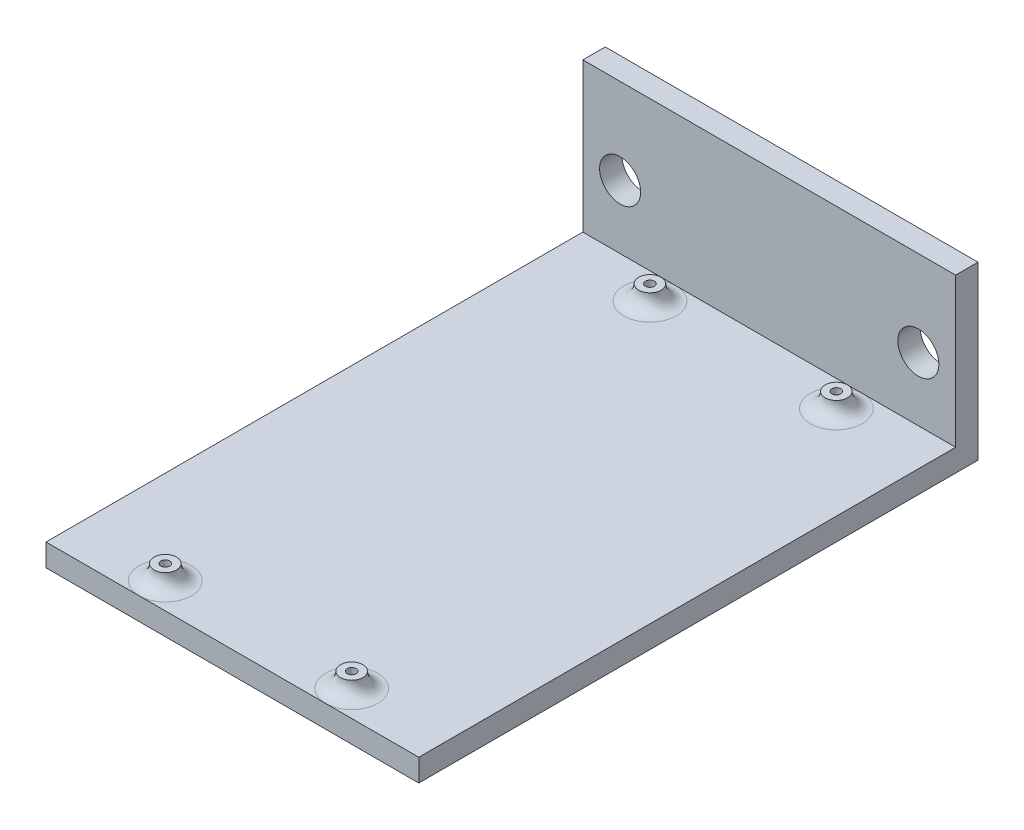
ISO-10303-21;
HEADER;
FILE_DESCRIPTION(('STEP AP214'),'2;1');
FILE_NAME('part.step','',(''),(''),'','','');
FILE_SCHEMA(('AUTOMOTIVE_DESIGN { 1 0 10303 214 1 1 1 1 }'));
ENDSEC;
DATA;
#1=APPLICATION_CONTEXT('core data for automotive mechanical design processes');
#2=APPLICATION_PROTOCOL_DEFINITION('international standard','automotive_design',2000,#1);
#3=PRODUCT_CONTEXT('',#1,'mechanical');
#4=PRODUCT('Part','Part','',(#3));
#5=PRODUCT_RELATED_PRODUCT_CATEGORY('part','',(#4));
#6=PRODUCT_DEFINITION_FORMATION('','',#4);
#7=PRODUCT_DEFINITION_CONTEXT('part definition',#1,'design');
#8=PRODUCT_DEFINITION('design','',#6,#7);
#9=PRODUCT_DEFINITION_SHAPE('','',#8);
#10=(LENGTH_UNIT() NAMED_UNIT(*) SI_UNIT(.MILLI.,.METRE.));
#11=(NAMED_UNIT(*) PLANE_ANGLE_UNIT() SI_UNIT($,.RADIAN.));
#12=(NAMED_UNIT(*) SI_UNIT($,.STERADIAN.) SOLID_ANGLE_UNIT());
#13=UNCERTAINTY_MEASURE_WITH_UNIT(LENGTH_MEASURE(1.E-05),#10,'distance_accuracy_value','');
#14=(GEOMETRIC_REPRESENTATION_CONTEXT(3) GLOBAL_UNCERTAINTY_ASSIGNED_CONTEXT((#13)) GLOBAL_UNIT_ASSIGNED_CONTEXT((#10,
#11,#12)) REPRESENTATION_CONTEXT('',''));
#15=CARTESIAN_POINT('',(0.,0.,0.));
#16=DIRECTION('',(0.,0.,1.));
#17=DIRECTION('',(1.,0.,0.));
#18=AXIS2_PLACEMENT_3D('',#15,#16,#17);
#19=CARTESIAN_POINT('',(25.,3.,-37.5));
#20=DIRECTION('',(-1.,0.,0.));
#21=DIRECTION('',(0.,0.,1.));
#22=AXIS2_PLACEMENT_3D('',#19,#20,#21);
#23=PLANE('',#22);
#24=DIRECTION('',(0.,0.,-1.));
#25=VECTOR('',#24,1.);
#26=CARTESIAN_POINT('',(25.,0.,-37.5));
#27=LINE('',#26,#25);
#28=CARTESIAN_POINT('',(25.,0.,37.5));
#29=VERTEX_POINT('',#28);
#30=CARTESIAN_POINT('',(25.,0.,-37.5));
#31=VERTEX_POINT('',#30);
#32=EDGE_CURVE('E129',#29,#31,#27,.T.);
#33=ORIENTED_EDGE('',*,*,#32,.T.);
#34=DIRECTION('',(0.,-1.,0.));
#35=VECTOR('',#34,1.);
#36=CARTESIAN_POINT('',(25.,3.,-37.5));
#37=LINE('',#36,#35);
#38=CARTESIAN_POINT('',(25.,23.,-37.5));
#39=VERTEX_POINT('',#38);
#40=EDGE_CURVE('E170',#39,#31,#37,.T.);
#41=ORIENTED_EDGE('',*,*,#40,.F.);
#42=DIRECTION('',(0.,0.,-1.));
#43=VECTOR('',#42,1.);
#44=CARTESIAN_POINT('',(25.,23.,-37.5));
#45=LINE('',#44,#43);
#46=CARTESIAN_POINT('',(25.,23.,-34.5));
#47=VERTEX_POINT('',#46);
#48=EDGE_CURVE('E111',#47,#39,#45,.T.);
#49=ORIENTED_EDGE('',*,*,#48,.F.);
#50=DIRECTION('',(0.,-1.,0.));
#51=VECTOR('',#50,1.);
#52=CARTESIAN_POINT('',(25.,23.,-34.5));
#53=LINE('',#52,#51);
#54=CARTESIAN_POINT('',(25.,3.,-34.5));
#55=VERTEX_POINT('',#54);
#56=EDGE_CURVE('E106',#47,#55,#53,.T.);
#57=ORIENTED_EDGE('',*,*,#56,.T.);
#58=DIRECTION('',(0.,0.,-1.));
#59=VECTOR('',#58,1.);
#60=CARTESIAN_POINT('',(25.,3.,-37.5));
#61=LINE('',#60,#59);
#62=CARTESIAN_POINT('',(25.,3.,37.5));
#63=VERTEX_POINT('',#62);
#64=EDGE_CURVE('E139',#63,#55,#61,.T.);
#65=ORIENTED_EDGE('',*,*,#64,.F.);
#66=DIRECTION('',(0.,-1.,0.));
#67=VECTOR('',#66,1.);
#68=CARTESIAN_POINT('',(25.,3.,37.5));
#69=LINE('',#68,#67);
#70=EDGE_CURVE('E150',#63,#29,#69,.T.);
#71=ORIENTED_EDGE('',*,*,#70,.T.);
#72=EDGE_LOOP('',(#33,#41,#49,#57,#65,#71));
#73=FACE_BOUND('',#72,.T.);
#74=ADVANCED_FACE('F38',(#73),#23,.F.);
#75=CARTESIAN_POINT('',(-25.,3.,-37.5));
#76=DIRECTION('',(0.,0.,1.));
#77=DIRECTION('',(1.,0.,0.));
#78=AXIS2_PLACEMENT_3D('',#75,#76,#77);
#79=PLANE('',#78);
#80=CARTESIAN_POINT('',(20.,11.5,-37.5));
#81=DIRECTION('',(0.,0.,-1.));
#82=DIRECTION('',(-1.,0.,0.));
#83=AXIS2_PLACEMENT_3D('',#80,#81,#82);
#84=CIRCLE('',#83,2.74999999999999);
#85=CARTESIAN_POINT('',(17.25,11.5,-37.5));
#86=VERTEX_POINT('',#85);
#87=EDGE_CURVE('E230',#86,#86,#84,.T.);
#88=ORIENTED_EDGE('',*,*,#87,.F.);
#89=EDGE_LOOP('',(#88));
#90=FACE_BOUND('',#89,.T.);
#91=CARTESIAN_POINT('',(-20.,11.5,-37.5));
#92=DIRECTION('',(0.,0.,-1.));
#93=DIRECTION('',(-1.,0.,0.));
#94=AXIS2_PLACEMENT_3D('',#91,#92,#93);
#95=CIRCLE('',#94,2.74999999999999);
#96=CARTESIAN_POINT('',(-22.75,11.5,-37.5));
#97=VERTEX_POINT('',#96);
#98=EDGE_CURVE('E180',#97,#97,#95,.T.);
#99=ORIENTED_EDGE('',*,*,#98,.F.);
#100=EDGE_LOOP('',(#99));
#101=FACE_BOUND('',#100,.T.);
#102=DIRECTION('',(-1.,0.,0.));
#103=VECTOR('',#102,1.);
#104=CARTESIAN_POINT('',(-25.,0.,-37.5));
#105=LINE('',#104,#103);
#106=CARTESIAN_POINT('',(-25.,0.,-37.5));
#107=VERTEX_POINT('',#106);
#108=EDGE_CURVE('E134',#31,#107,#105,.T.);
#109=ORIENTED_EDGE('',*,*,#108,.T.);
#110=DIRECTION('',(0.,-1.,0.));
#111=VECTOR('',#110,1.);
#112=CARTESIAN_POINT('',(-25.,3.,-37.5));
#113=LINE('',#112,#111);
#114=CARTESIAN_POINT('',(-25.,23.,-37.5));
#115=VERTEX_POINT('',#114);
#116=EDGE_CURVE('E167',#115,#107,#113,.T.);
#117=ORIENTED_EDGE('',*,*,#116,.F.);
#118=DIRECTION('',(-1.,0.,0.));
#119=VECTOR('',#118,1.);
#120=CARTESIAN_POINT('',(-25.,23.,-37.5));
#121=LINE('',#120,#119);
#122=EDGE_CURVE('E118',#39,#115,#121,.T.);
#123=ORIENTED_EDGE('',*,*,#122,.F.);
#124=ORIENTED_EDGE('',*,*,#40,.T.);
#125=EDGE_LOOP('',(#109,#117,#123,#124));
#126=FACE_BOUND('',#125,.T.);
#127=ADVANCED_FACE('F251',(#90,#101,#126),#79,.F.);
#128=CARTESIAN_POINT('',(-25.,3.,-37.5));
#129=DIRECTION('',(1.,0.,0.));
#130=DIRECTION('',(0.,0.,-1.));
#131=AXIS2_PLACEMENT_3D('',#128,#129,#130);
#132=PLANE('',#131);
#133=DIRECTION('',(0.,0.,1.));
#134=VECTOR('',#133,1.);
#135=CARTESIAN_POINT('',(-25.,0.,-37.5));
#136=LINE('',#135,#134);
#137=CARTESIAN_POINT('',(-25.,0.,37.5));
#138=VERTEX_POINT('',#137);
#139=EDGE_CURVE('E155',#107,#138,#136,.T.);
#140=ORIENTED_EDGE('',*,*,#139,.T.);
#141=DIRECTION('',(0.,-1.,0.));
#142=VECTOR('',#141,1.);
#143=CARTESIAN_POINT('',(-25.,3.,37.5));
#144=LINE('',#143,#142);
#145=CARTESIAN_POINT('',(-25.,3.,37.5));
#146=VERTEX_POINT('',#145);
#147=EDGE_CURVE('E163',#146,#138,#144,.T.);
#148=ORIENTED_EDGE('',*,*,#147,.F.);
#149=DIRECTION('',(0.,0.,1.));
#150=VECTOR('',#149,1.);
#151=CARTESIAN_POINT('',(-25.,3.,-37.5));
#152=LINE('',#151,#150);
#153=CARTESIAN_POINT('',(-25.,3.,-34.5));
#154=VERTEX_POINT('',#153);
#155=EDGE_CURVE('E127',#154,#146,#152,.T.);
#156=ORIENTED_EDGE('',*,*,#155,.F.);
#157=DIRECTION('',(0.,-1.,0.));
#158=VECTOR('',#157,1.);
#159=CARTESIAN_POINT('',(-25.,23.,-34.5));
#160=LINE('',#159,#158);
#161=CARTESIAN_POINT('',(-25.,23.,-34.5));
#162=VERTEX_POINT('',#161);
#163=EDGE_CURVE('E104',#162,#154,#160,.T.);
#164=ORIENTED_EDGE('',*,*,#163,.F.);
#165=DIRECTION('',(0.,0.,1.));
#166=VECTOR('',#165,1.);
#167=CARTESIAN_POINT('',(-25.,23.,-37.5));
#168=LINE('',#167,#166);
#169=EDGE_CURVE('E112',#115,#162,#168,.T.);
#170=ORIENTED_EDGE('',*,*,#169,.F.);
#171=ORIENTED_EDGE('',*,*,#116,.T.);
#172=EDGE_LOOP('',(#140,#148,#156,#164,#170,#171));
#173=FACE_BOUND('',#172,.T.);
#174=ADVANCED_FACE('F125',(#173),#132,.F.);
#175=CARTESIAN_POINT('',(-25.,3.,37.5));
#176=DIRECTION('',(0.,0.,-1.));
#177=DIRECTION('',(-1.,0.,0.));
#178=AXIS2_PLACEMENT_3D('',#175,#176,#177);
#179=PLANE('',#178);
#180=DIRECTION('',(1.,0.,0.));
#181=VECTOR('',#180,1.);
#182=CARTESIAN_POINT('',(-25.,0.,37.5));
#183=LINE('',#182,#181);
#184=EDGE_CURVE('E143',#138,#29,#183,.T.);
#185=ORIENTED_EDGE('',*,*,#184,.T.);
#186=ORIENTED_EDGE('',*,*,#70,.F.);
#187=DIRECTION('',(1.,0.,0.));
#188=VECTOR('',#187,1.);
#189=CARTESIAN_POINT('',(-25.,3.,37.5));
#190=LINE('',#189,#188);
#191=CARTESIAN_POINT('',(12.5,3.,37.5));
#192=VERTEX_POINT('',#191);
#193=EDGE_CURVE('E146',#192,#63,#190,.T.);
#194=ORIENTED_EDGE('',*,*,#193,.F.);
#195=CARTESIAN_POINT('',(-12.5,3.,37.5));
#196=VERTEX_POINT('',#195);
#197=EDGE_CURVE('E151',#196,#192,#190,.T.);
#198=ORIENTED_EDGE('',*,*,#197,.F.);
#199=EDGE_CURVE('E147',#146,#196,#190,.T.);
#200=ORIENTED_EDGE('',*,*,#199,.F.);
#201=ORIENTED_EDGE('',*,*,#147,.T.);
#202=EDGE_LOOP('',(#185,#186,#194,#198,#200,#201));
#203=FACE_BOUND('',#202,.T.);
#204=ADVANCED_FACE('F195',(#203),#179,.F.);
#205=CARTESIAN_POINT('',(0.,3.,0.));
#206=DIRECTION('',(0.,1.,0.));
#207=DIRECTION('',(0.,0.,1.));
#208=AXIS2_PLACEMENT_3D('',#205,#206,#207);
#209=PLANE('',#208);
#210=ORIENTED_EDGE('',*,*,#197,.T.);
#211=CARTESIAN_POINT('',(12.5,3.,34.));
#212=DIRECTION('',(0.,1.,0.));
#213=DIRECTION('',(0.,0.,1.));
#214=AXIS2_PLACEMENT_3D('',#211,#212,#213);
#215=CIRCLE('',#214,3.5);
#216=EDGE_CURVE('E11',#192,#192,#215,.F.);
#217=ORIENTED_EDGE('',*,*,#216,.T.);
#218=ORIENTED_EDGE('',*,*,#193,.T.);
#219=ORIENTED_EDGE('',*,*,#64,.T.);
#220=DIRECTION('',(1.,0.,0.));
#221=VECTOR('',#220,1.);
#222=CARTESIAN_POINT('',(-25.,3.,-34.5));
#223=LINE('',#222,#221);
#224=CARTESIAN_POINT('',(12.5,3.,-34.5));
#225=VERTEX_POINT('',#224);
#226=EDGE_CURVE('E179',#225,#55,#223,.T.);
#227=ORIENTED_EDGE('',*,*,#226,.F.);
#228=CARTESIAN_POINT('',(12.5,3.,-31.));
#229=DIRECTION('',(0.,1.,0.));
#230=DIRECTION('',(0.,0.,1.));
#231=AXIS2_PLACEMENT_3D('',#228,#229,#230);
#232=CIRCLE('',#231,3.5);
#233=EDGE_CURVE('E184',#225,#225,#232,.F.);
#234=ORIENTED_EDGE('',*,*,#233,.T.);
#235=CARTESIAN_POINT('',(-12.5,3.,-34.5));
#236=VERTEX_POINT('',#235);
#237=EDGE_CURVE('E209',#236,#225,#223,.T.);
#238=ORIENTED_EDGE('',*,*,#237,.F.);
#239=CARTESIAN_POINT('',(-12.5,3.,-31.));
#240=DIRECTION('',(0.,1.,0.));
#241=DIRECTION('',(0.,0.,1.));
#242=AXIS2_PLACEMENT_3D('',#239,#240,#241);
#243=CIRCLE('',#242,3.5);
#244=EDGE_CURVE('E174',#236,#236,#243,.F.);
#245=ORIENTED_EDGE('',*,*,#244,.T.);
#246=EDGE_CURVE('E122',#154,#236,#223,.T.);
#247=ORIENTED_EDGE('',*,*,#246,.F.);
#248=ORIENTED_EDGE('',*,*,#155,.T.);
#249=ORIENTED_EDGE('',*,*,#199,.T.);
#250=CARTESIAN_POINT('',(-12.5,3.,34.));
#251=DIRECTION('',(0.,1.,0.));
#252=DIRECTION('',(0.,0.,1.));
#253=AXIS2_PLACEMENT_3D('',#250,#251,#252);
#254=CIRCLE('',#253,3.5);
#255=EDGE_CURVE('E47',#196,#196,#254,.F.);
#256=ORIENTED_EDGE('',*,*,#255,.T.);
#257=EDGE_LOOP('',(#210,#217,#218,#219,#227,#234,#238,#245,#247,#248,#249,#256));
#258=FACE_BOUND('',#257,.T.);
#259=ADVANCED_FACE('F191',(#258),#209,.T.);
#260=CARTESIAN_POINT('',(0.,0.,0.));
#261=DIRECTION('',(0.,1.,0.));
#262=DIRECTION('',(0.,0.,1.));
#263=AXIS2_PLACEMENT_3D('',#260,#261,#262);
#264=PLANE('',#263);
#265=CARTESIAN_POINT('',(-12.5,0.,34.));
#266=DIRECTION('',(0.,1.,0.));
#267=DIRECTION('',(0.,0.,1.));
#268=AXIS2_PLACEMENT_3D('',#265,#266,#267);
#269=CIRCLE('',#268,0.600000000000001);
#270=CARTESIAN_POINT('',(-12.5,0.,34.6));
#271=VERTEX_POINT('',#270);
#272=EDGE_CURVE('E302',#271,#271,#269,.F.);
#273=ORIENTED_EDGE('',*,*,#272,.F.);
#274=EDGE_LOOP('',(#273));
#275=FACE_BOUND('',#274,.T.);
#276=CARTESIAN_POINT('',(12.5,0.,34.));
#277=DIRECTION('',(0.,1.,0.));
#278=DIRECTION('',(0.,0.,1.));
#279=AXIS2_PLACEMENT_3D('',#276,#277,#278);
#280=CIRCLE('',#279,0.600000000000001);
#281=CARTESIAN_POINT('',(12.5,0.,34.6));
#282=VERTEX_POINT('',#281);
#283=EDGE_CURVE('E311',#282,#282,#280,.F.);
#284=ORIENTED_EDGE('',*,*,#283,.F.);
#285=EDGE_LOOP('',(#284));
#286=FACE_BOUND('',#285,.T.);
#287=CARTESIAN_POINT('',(12.5,0.,-31.));
#288=DIRECTION('',(0.,1.,0.));
#289=DIRECTION('',(0.,0.,1.));
#290=AXIS2_PLACEMENT_3D('',#287,#288,#289);
#291=CIRCLE('',#290,0.6);
#292=CARTESIAN_POINT('',(12.5,0.,-30.4));
#293=VERTEX_POINT('',#292);
#294=EDGE_CURVE('E301',#293,#293,#291,.F.);
#295=ORIENTED_EDGE('',*,*,#294,.F.);
#296=EDGE_LOOP('',(#295));
#297=FACE_BOUND('',#296,.T.);
#298=CARTESIAN_POINT('',(-12.5,0.,-31.));
#299=DIRECTION('',(0.,1.,0.));
#300=DIRECTION('',(0.,0.,1.));
#301=AXIS2_PLACEMENT_3D('',#298,#299,#300);
#302=CIRCLE('',#301,0.6);
#303=CARTESIAN_POINT('',(-12.5,0.,-30.4));
#304=VERTEX_POINT('',#303);
#305=EDGE_CURVE('E292',#304,#304,#302,.F.);
#306=ORIENTED_EDGE('',*,*,#305,.F.);
#307=EDGE_LOOP('',(#306));
#308=FACE_BOUND('',#307,.T.);
#309=ORIENTED_EDGE('',*,*,#32,.F.);
#310=ORIENTED_EDGE('',*,*,#184,.F.);
#311=ORIENTED_EDGE('',*,*,#139,.F.);
#312=ORIENTED_EDGE('',*,*,#108,.F.);
#313=EDGE_LOOP('',(#309,#310,#311,#312));
#314=FACE_BOUND('',#313,.T.);
#315=ADVANCED_FACE('F258',(#275,#286,#297,#308,#314),#264,.F.);
#316=CARTESIAN_POINT('',(-25.,23.,-34.5));
#317=DIRECTION('',(0.,0.,-1.));
#318=DIRECTION('',(-1.,0.,0.));
#319=AXIS2_PLACEMENT_3D('',#316,#317,#318);
#320=PLANE('',#319);
#321=CARTESIAN_POINT('',(20.,11.5,-34.5));
#322=DIRECTION('',(0.,0.,-1.));
#323=DIRECTION('',(-1.,0.,0.));
#324=AXIS2_PLACEMENT_3D('',#321,#322,#323);
#325=CIRCLE('',#324,2.74999999999999);
#326=CARTESIAN_POINT('',(17.25,11.5,-34.5));
#327=VERTEX_POINT('',#326);
#328=EDGE_CURVE('E240',#327,#327,#325,.T.);
#329=ORIENTED_EDGE('',*,*,#328,.T.);
#330=EDGE_LOOP('',(#329));
#331=FACE_BOUND('',#330,.T.);
#332=CARTESIAN_POINT('',(-20.,11.5,-34.5));
#333=DIRECTION('',(0.,0.,-1.));
#334=DIRECTION('',(-1.,0.,0.));
#335=AXIS2_PLACEMENT_3D('',#332,#333,#334);
#336=CIRCLE('',#335,2.74999999999999);
#337=CARTESIAN_POINT('',(-22.75,11.5,-34.5));
#338=VERTEX_POINT('',#337);
#339=EDGE_CURVE('E175',#338,#338,#336,.T.);
#340=ORIENTED_EDGE('',*,*,#339,.T.);
#341=EDGE_LOOP('',(#340));
#342=FACE_BOUND('',#341,.T.);
#343=ORIENTED_EDGE('',*,*,#246,.T.);
#344=ORIENTED_EDGE('',*,*,#237,.T.);
#345=ORIENTED_EDGE('',*,*,#226,.T.);
#346=ORIENTED_EDGE('',*,*,#56,.F.);
#347=DIRECTION('',(1.,0.,0.));
#348=VECTOR('',#347,1.);
#349=CARTESIAN_POINT('',(-25.,23.,-34.5));
#350=LINE('',#349,#348);
#351=EDGE_CURVE('E99',#162,#47,#350,.T.);
#352=ORIENTED_EDGE('',*,*,#351,.F.);
#353=ORIENTED_EDGE('',*,*,#163,.T.);
#354=EDGE_LOOP('',(#343,#344,#345,#346,#352,#353));
#355=FACE_BOUND('',#354,.T.);
#356=ADVANCED_FACE('F102',(#331,#342,#355),#320,.F.);
#357=CARTESIAN_POINT('',(0.,23.,0.));
#358=DIRECTION('',(0.,1.,0.));
#359=DIRECTION('',(0.,0.,1.));
#360=AXIS2_PLACEMENT_3D('',#357,#358,#359);
#361=PLANE('',#360);
#362=ORIENTED_EDGE('',*,*,#169,.T.);
#363=ORIENTED_EDGE('',*,*,#351,.T.);
#364=ORIENTED_EDGE('',*,*,#48,.T.);
#365=ORIENTED_EDGE('',*,*,#122,.T.);
#366=EDGE_LOOP('',(#362,#363,#364,#365));
#367=FACE_BOUND('',#366,.T.);
#368=ADVANCED_FACE('F116',(#367),#361,.T.);
#369=CARTESIAN_POINT('',(-20.,11.5,-37.5));
#370=DIRECTION('',(0.,0.,-1.));
#371=DIRECTION('',(-1.,0.,0.));
#372=AXIS2_PLACEMENT_3D('',#369,#370,#371);
#373=CYLINDRICAL_SURFACE('',#372,2.74999999999999);
#374=ORIENTED_EDGE('',*,*,#98,.T.);
#375=EDGE_LOOP('',(#374));
#376=FACE_BOUND('',#375,.T.);
#377=ORIENTED_EDGE('',*,*,#339,.F.);
#378=EDGE_LOOP('',(#377));
#379=FACE_BOUND('',#378,.T.);
#380=ADVANCED_FACE('F248',(#376,#379),#373,.F.);
#381=CARTESIAN_POINT('',(20.,11.5,-37.5));
#382=DIRECTION('',(0.,0.,-1.));
#383=DIRECTION('',(-1.,0.,0.));
#384=AXIS2_PLACEMENT_3D('',#381,#382,#383);
#385=CYLINDRICAL_SURFACE('',#384,2.74999999999999);
#386=ORIENTED_EDGE('',*,*,#87,.T.);
#387=EDGE_LOOP('',(#386));
#388=FACE_BOUND('',#387,.T.);
#389=ORIENTED_EDGE('',*,*,#328,.F.);
#390=EDGE_LOOP('',(#389));
#391=FACE_BOUND('',#390,.T.);
#392=ADVANCED_FACE('F341',(#388,#391),#385,.F.);
#393=CARTESIAN_POINT('',(-12.5,5.,-31.));
#394=DIRECTION('',(0.,1.,0.));
#395=DIRECTION('',(0.,0.,1.));
#396=AXIS2_PLACEMENT_3D('',#393,#394,#395);
#397=PLANE('',#396);
#398=CARTESIAN_POINT('',(-12.5,5.,-31.));
#399=DIRECTION('',(0.,1.,0.));
#400=DIRECTION('',(0.,0.,1.));
#401=AXIS2_PLACEMENT_3D('',#398,#399,#400);
#402=CIRCLE('',#401,0.6);
#403=CARTESIAN_POINT('',(-12.5,5.,-30.4));
#404=VERTEX_POINT('',#403);
#405=EDGE_CURVE('E295',#404,#404,#402,.T.);
#406=ORIENTED_EDGE('',*,*,#405,.F.);
#407=EDGE_LOOP('',(#406));
#408=FACE_BOUND('',#407,.T.);
#409=CARTESIAN_POINT('',(-12.5,5.,-31.));
#410=DIRECTION('',(0.,1.,0.));
#411=DIRECTION('',(0.,0.,1.));
#412=AXIS2_PLACEMENT_3D('',#409,#410,#411);
#413=CIRCLE('',#412,1.5);
#414=CARTESIAN_POINT('',(-12.5,5.,-29.5));
#415=VERTEX_POINT('',#414);
#416=EDGE_CURVE('E224',#415,#415,#413,.T.);
#417=ORIENTED_EDGE('',*,*,#416,.T.);
#418=EDGE_LOOP('',(#417));
#419=FACE_BOUND('',#418,.T.);
#420=ADVANCED_FACE('F332',(#408,#419),#397,.T.);
#421=CARTESIAN_POINT('',(12.5,5.,-31.));
#422=DIRECTION('',(0.,1.,0.));
#423=DIRECTION('',(0.,0.,1.));
#424=AXIS2_PLACEMENT_3D('',#421,#422,#423);
#425=PLANE('',#424);
#426=CARTESIAN_POINT('',(12.5,5.,-31.));
#427=DIRECTION('',(0.,1.,0.));
#428=DIRECTION('',(0.,0.,1.));
#429=AXIS2_PLACEMENT_3D('',#426,#427,#428);
#430=CIRCLE('',#429,0.6);
#431=CARTESIAN_POINT('',(12.5,5.,-30.4));
#432=VERTEX_POINT('',#431);
#433=EDGE_CURVE('E315',#432,#432,#430,.T.);
#434=ORIENTED_EDGE('',*,*,#433,.F.);
#435=EDGE_LOOP('',(#434));
#436=FACE_BOUND('',#435,.T.);
#437=CARTESIAN_POINT('',(12.5,5.,-31.));
#438=DIRECTION('',(0.,1.,0.));
#439=DIRECTION('',(0.,0.,1.));
#440=AXIS2_PLACEMENT_3D('',#437,#438,#439);
#441=CIRCLE('',#440,1.5);
#442=CARTESIAN_POINT('',(12.5,5.,-29.5));
#443=VERTEX_POINT('',#442);
#444=EDGE_CURVE('E221',#443,#443,#441,.T.);
#445=ORIENTED_EDGE('',*,*,#444,.T.);
#446=EDGE_LOOP('',(#445));
#447=FACE_BOUND('',#446,.T.);
#448=ADVANCED_FACE('F329',(#436,#447),#425,.T.);
#449=CARTESIAN_POINT('',(12.5,5.,34.));
#450=DIRECTION('',(0.,1.,0.));
#451=DIRECTION('',(0.,0.,1.));
#452=AXIS2_PLACEMENT_3D('',#449,#450,#451);
#453=PLANE('',#452);
#454=CARTESIAN_POINT('',(12.5,5.,34.));
#455=DIRECTION('',(0.,1.,0.));
#456=DIRECTION('',(0.,0.,1.));
#457=AXIS2_PLACEMENT_3D('',#454,#455,#456);
#458=CIRCLE('',#457,0.600000000000001);
#459=CARTESIAN_POINT('',(12.5,5.,34.6));
#460=VERTEX_POINT('',#459);
#461=EDGE_CURVE('E306',#460,#460,#458,.T.);
#462=ORIENTED_EDGE('',*,*,#461,.F.);
#463=EDGE_LOOP('',(#462));
#464=FACE_BOUND('',#463,.T.);
#465=CARTESIAN_POINT('',(12.5,5.,34.));
#466=DIRECTION('',(0.,1.,0.));
#467=DIRECTION('',(0.,0.,1.));
#468=AXIS2_PLACEMENT_3D('',#465,#466,#467);
#469=CIRCLE('',#468,1.5);
#470=CARTESIAN_POINT('',(12.5,5.,35.5));
#471=VERTEX_POINT('',#470);
#472=EDGE_CURVE('E225',#471,#471,#469,.T.);
#473=ORIENTED_EDGE('',*,*,#472,.T.);
#474=EDGE_LOOP('',(#473));
#475=FACE_BOUND('',#474,.T.);
#476=ADVANCED_FACE('F331',(#464,#475),#453,.T.);
#477=CARTESIAN_POINT('',(-12.5,5.,34.));
#478=DIRECTION('',(0.,1.,0.));
#479=DIRECTION('',(0.,0.,1.));
#480=AXIS2_PLACEMENT_3D('',#477,#478,#479);
#481=PLANE('',#480);
#482=CARTESIAN_POINT('',(-12.5,5.,34.));
#483=DIRECTION('',(0.,1.,0.));
#484=DIRECTION('',(0.,0.,1.));
#485=AXIS2_PLACEMENT_3D('',#482,#483,#484);
#486=CIRCLE('',#485,0.600000000000001);
#487=CARTESIAN_POINT('',(-12.5,5.,34.6));
#488=VERTEX_POINT('',#487);
#489=EDGE_CURVE('E307',#488,#488,#486,.T.);
#490=ORIENTED_EDGE('',*,*,#489,.F.);
#491=EDGE_LOOP('',(#490));
#492=FACE_BOUND('',#491,.T.);
#493=CARTESIAN_POINT('',(-12.5,5.,34.));
#494=DIRECTION('',(0.,1.,0.));
#495=DIRECTION('',(0.,0.,1.));
#496=AXIS2_PLACEMENT_3D('',#493,#494,#495);
#497=CIRCLE('',#496,1.5);
#498=CARTESIAN_POINT('',(-12.5,5.,35.5));
#499=VERTEX_POINT('',#498);
#500=EDGE_CURVE('E233',#499,#499,#497,.T.);
#501=ORIENTED_EDGE('',*,*,#500,.T.);
#502=EDGE_LOOP('',(#501));
#503=FACE_BOUND('',#502,.T.);
#504=ADVANCED_FACE('F338',(#492,#503),#481,.T.);
#505=CARTESIAN_POINT('',(-12.5,-0.00100000000000013,34.));
#506=DIRECTION('',(0.,1.,0.));
#507=DIRECTION('',(0.,0.,1.));
#508=AXIS2_PLACEMENT_3D('',#505,#506,#507);
#509=CYLINDRICAL_SURFACE('',#508,0.600000000000001);
#510=ORIENTED_EDGE('',*,*,#489,.T.);
#511=EDGE_LOOP('',(#510));
#512=FACE_BOUND('',#511,.T.);
#513=ORIENTED_EDGE('',*,*,#272,.T.);
#514=EDGE_LOOP('',(#513));
#515=FACE_BOUND('',#514,.T.);
#516=ADVANCED_FACE('F391',(#512,#515),#509,.F.);
#517=CARTESIAN_POINT('',(12.5,-0.00100000000000013,34.));
#518=DIRECTION('',(0.,1.,0.));
#519=DIRECTION('',(0.,0.,1.));
#520=AXIS2_PLACEMENT_3D('',#517,#518,#519);
#521=CYLINDRICAL_SURFACE('',#520,0.600000000000001);
#522=ORIENTED_EDGE('',*,*,#461,.T.);
#523=EDGE_LOOP('',(#522));
#524=FACE_BOUND('',#523,.T.);
#525=ORIENTED_EDGE('',*,*,#283,.T.);
#526=EDGE_LOOP('',(#525));
#527=FACE_BOUND('',#526,.T.);
#528=ADVANCED_FACE('F400',(#524,#527),#521,.F.);
#529=CARTESIAN_POINT('',(12.5,-0.00100000000000013,-31.));
#530=DIRECTION('',(0.,1.,0.));
#531=DIRECTION('',(0.,0.,1.));
#532=AXIS2_PLACEMENT_3D('',#529,#530,#531);
#533=CYLINDRICAL_SURFACE('',#532,0.6);
#534=ORIENTED_EDGE('',*,*,#433,.T.);
#535=EDGE_LOOP('',(#534));
#536=FACE_BOUND('',#535,.T.);
#537=ORIENTED_EDGE('',*,*,#294,.T.);
#538=EDGE_LOOP('',(#537));
#539=FACE_BOUND('',#538,.T.);
#540=ADVANCED_FACE('F326',(#536,#539),#533,.F.);
#541=CARTESIAN_POINT('',(-12.5,-0.00100000000000013,-31.));
#542=DIRECTION('',(0.,1.,0.));
#543=DIRECTION('',(0.,0.,1.));
#544=AXIS2_PLACEMENT_3D('',#541,#542,#543);
#545=CYLINDRICAL_SURFACE('',#544,0.6);
#546=ORIENTED_EDGE('',*,*,#405,.T.);
#547=EDGE_LOOP('',(#546));
#548=FACE_BOUND('',#547,.T.);
#549=ORIENTED_EDGE('',*,*,#305,.T.);
#550=EDGE_LOOP('',(#549));
#551=FACE_BOUND('',#550,.T.);
#552=ADVANCED_FACE('F283',(#548,#551),#545,.F.);
#553=CARTESIAN_POINT('',(12.5,5.,34.));
#554=DIRECTION('',(0.,1.,0.));
#555=DIRECTION('',(0.,0.,1.));
#556=AXIS2_PLACEMENT_3D('',#553,#554,#555);
#557=TOROIDAL_SURFACE('',#556,3.5,2.);
#558=ORIENTED_EDGE('',*,*,#216,.F.);
#559=EDGE_LOOP('',(#558));
#560=FACE_BOUND('',#559,.T.);
#561=ORIENTED_EDGE('',*,*,#472,.F.);
#562=EDGE_LOOP('',(#561));
#563=FACE_BOUND('',#562,.T.);
#564=ADVANCED_FACE('F280',(#560,#563),#557,.F.);
#565=CARTESIAN_POINT('',(-12.5,5.,34.));
#566=DIRECTION('',(0.,1.,0.));
#567=DIRECTION('',(0.,0.,1.));
#568=AXIS2_PLACEMENT_3D('',#565,#566,#567);
#569=TOROIDAL_SURFACE('',#568,3.5,2.);
#570=ORIENTED_EDGE('',*,*,#255,.F.);
#571=EDGE_LOOP('',(#570));
#572=FACE_BOUND('',#571,.T.);
#573=ORIENTED_EDGE('',*,*,#500,.F.);
#574=EDGE_LOOP('',(#573));
#575=FACE_BOUND('',#574,.T.);
#576=ADVANCED_FACE('F218',(#572,#575),#569,.F.);
#577=CARTESIAN_POINT('',(12.5,5.,-31.));
#578=DIRECTION('',(0.,1.,0.));
#579=DIRECTION('',(0.,0.,1.));
#580=AXIS2_PLACEMENT_3D('',#577,#578,#579);
#581=TOROIDAL_SURFACE('',#580,3.5,2.);
#582=ORIENTED_EDGE('',*,*,#233,.F.);
#583=EDGE_LOOP('',(#582));
#584=FACE_BOUND('',#583,.T.);
#585=ORIENTED_EDGE('',*,*,#444,.F.);
#586=EDGE_LOOP('',(#585));
#587=FACE_BOUND('',#586,.T.);
#588=ADVANCED_FACE('F215',(#584,#587),#581,.F.);
#589=CARTESIAN_POINT('',(-12.5,5.,-31.));
#590=DIRECTION('',(0.,1.,0.));
#591=DIRECTION('',(0.,0.,1.));
#592=AXIS2_PLACEMENT_3D('',#589,#590,#591);
#593=TOROIDAL_SURFACE('',#592,3.5,2.);
#594=ORIENTED_EDGE('',*,*,#244,.F.);
#595=EDGE_LOOP('',(#594));
#596=FACE_BOUND('',#595,.T.);
#597=ORIENTED_EDGE('',*,*,#416,.F.);
#598=EDGE_LOOP('',(#597));
#599=FACE_BOUND('',#598,.T.);
#600=ADVANCED_FACE('F40',(#596,#599),#593,.F.);
#601=CLOSED_SHELL('',(#74,#127,#174,#204,#259,#315,#356,#368,#380,#392,#420,#448,#476,#504,#516,
#528,#540,#552,#564,#576,#588,#600));
#602=MANIFOLD_SOLID_BREP('B2',#601);
#603=ADVANCED_BREP_SHAPE_REPRESENTATION('',(#18,#602),#14);
#604=SHAPE_DEFINITION_REPRESENTATION(#9,#603);
ENDSEC;
END-ISO-10303-21;
